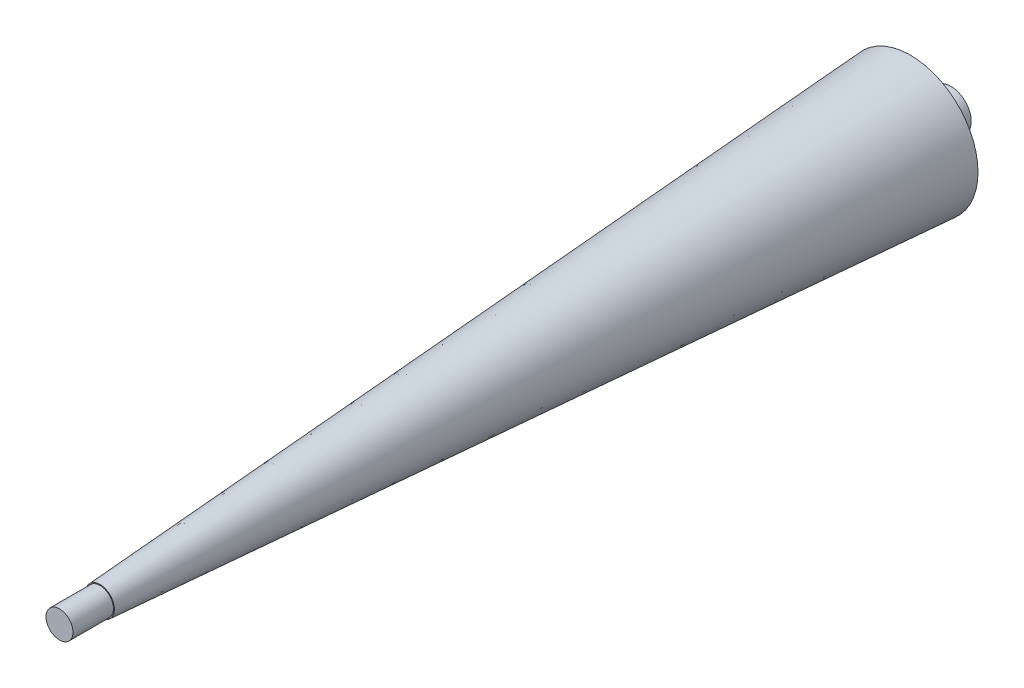
ISO-10303-21;
HEADER;
FILE_DESCRIPTION(('STEP AP214'),'2;1');
FILE_NAME('part.step','',(''),(''),'','','');
FILE_SCHEMA(('AUTOMOTIVE_DESIGN { 1 0 10303 214 1 1 1 1 }'));
ENDSEC;
DATA;
#1=APPLICATION_CONTEXT('core data for automotive mechanical design processes');
#2=APPLICATION_PROTOCOL_DEFINITION('international standard','automotive_design',2000,#1);
#3=PRODUCT_CONTEXT('',#1,'mechanical');
#4=PRODUCT('Part','Part','',(#3));
#5=PRODUCT_RELATED_PRODUCT_CATEGORY('part','',(#4));
#6=PRODUCT_DEFINITION_FORMATION('','',#4);
#7=PRODUCT_DEFINITION_CONTEXT('part definition',#1,'design');
#8=PRODUCT_DEFINITION('design','',#6,#7);
#9=PRODUCT_DEFINITION_SHAPE('','',#8);
#10=(LENGTH_UNIT() NAMED_UNIT(*) SI_UNIT(.MILLI.,.METRE.));
#11=(NAMED_UNIT(*) PLANE_ANGLE_UNIT() SI_UNIT($,.RADIAN.));
#12=(NAMED_UNIT(*) SI_UNIT($,.STERADIAN.) SOLID_ANGLE_UNIT());
#13=UNCERTAINTY_MEASURE_WITH_UNIT(LENGTH_MEASURE(1.E-05),#10,'distance_accuracy_value','');
#14=(GEOMETRIC_REPRESENTATION_CONTEXT(3) GLOBAL_UNCERTAINTY_ASSIGNED_CONTEXT((#13)) GLOBAL_UNIT_ASSIGNED_CONTEXT((#10,
#11,#12)) REPRESENTATION_CONTEXT('',''));
#15=CARTESIAN_POINT('',(0.,0.,0.));
#16=DIRECTION('',(0.,0.,1.));
#17=DIRECTION('',(1.,0.,0.));
#18=AXIS2_PLACEMENT_3D('',#15,#16,#17);
#19=CARTESIAN_POINT('',(0.,0.,0.));
#20=DIRECTION('',(0.,0.,-1.));
#21=DIRECTION('',(1.,0.,0.));
#22=AXIS2_PLACEMENT_3D('',#19,#20,#21);
#23=CONICAL_SURFACE('',#22,25.,0.0654498469497875);
#24=CARTESIAN_POINT('',(0.,0.,300.));
#25=DIRECTION('',(0.,0.,1.));
#26=DIRECTION('',(1.,0.,0.));
#27=AXIS2_PLACEMENT_3D('',#24,#25,#26);
#28=CIRCLE('',#27,5.33696115542849);
#29=CARTESIAN_POINT('',(5.33696115542849,0.,300.));
#30=VERTEX_POINT('',#29);
#31=EDGE_CURVE('E57',#30,#30,#28,.T.);
#32=CARTESIAN_POINT('',(0.,0.,0.));
#33=DIRECTION('',(0.,0.,1.));
#34=DIRECTION('',(1.,0.,0.));
#35=AXIS2_PLACEMENT_3D('',#32,#33,#34);
#36=CIRCLE('',#35,25.);
#37=CARTESIAN_POINT('',(25.,0.,0.));
#38=VERTEX_POINT('',#37);
#39=EDGE_CURVE('E53',#38,#38,#36,.T.);
#40=CARTESIAN_POINT('',(5.33696115542849,0.,300.));
#41=CARTESIAN_POINT('',(5.54178447672611,0.,296.875));
#42=CARTESIAN_POINT('',(5.74660779802373,0.,293.75));
#43=CARTESIAN_POINT('',(6.15625444061897,0.,287.5));
#44=CARTESIAN_POINT('',(6.36107776191659,0.,284.375));
#45=CARTESIAN_POINT('',(6.77072440451183,0.,278.125));
#46=CARTESIAN_POINT('',(6.97554772580945,0.,275.));
#47=CARTESIAN_POINT('',(7.38519436840469,0.,268.75));
#48=CARTESIAN_POINT('',(7.59001768970231,0.,265.625));
#49=CARTESIAN_POINT('',(7.99966433229755,0.,259.375));
#50=CARTESIAN_POINT('',(8.20448765359517,0.,256.25));
#51=CARTESIAN_POINT('',(8.61413429619041,0.,250.));
#52=CARTESIAN_POINT('',(8.81895761748803,0.,246.875));
#53=CARTESIAN_POINT('',(9.22860426008327,0.,240.625));
#54=CARTESIAN_POINT('',(9.43342758138089,0.,237.5));
#55=CARTESIAN_POINT('',(9.84307422397613,0.,231.25));
#56=CARTESIAN_POINT('',(10.0478975452737,0.,228.125));
#57=CARTESIAN_POINT('',(10.457544187869,0.,221.875));
#58=CARTESIAN_POINT('',(10.6623675091666,0.,218.75));
#59=CARTESIAN_POINT('',(11.0720141517618,0.,212.5));
#60=CARTESIAN_POINT('',(11.2768374730595,0.,209.375));
#61=CARTESIAN_POINT('',(11.6864841156547,0.,203.125));
#62=CARTESIAN_POINT('',(11.8913074369523,0.,200.));
#63=CARTESIAN_POINT('',(12.3009540795476,0.,193.75));
#64=CARTESIAN_POINT('',(12.5057774008452,0.,190.625));
#65=CARTESIAN_POINT('',(12.9154240434404,0.,184.375));
#66=CARTESIAN_POINT('',(13.120247364738,0.,181.25));
#67=CARTESIAN_POINT('',(13.5298940073333,0.,175.));
#68=CARTESIAN_POINT('',(13.7347173286309,0.,171.875));
#69=CARTESIAN_POINT('',(14.1443639712261,0.,165.625));
#70=CARTESIAN_POINT('',(14.3491872925238,0.,162.5));
#71=CARTESIAN_POINT('',(14.758833935119,0.,156.25));
#72=CARTESIAN_POINT('',(14.9636572564166,0.,153.125));
#73=CARTESIAN_POINT('',(15.3733038990119,0.,146.875));
#74=CARTESIAN_POINT('',(15.5781272203095,0.,143.75));
#75=CARTESIAN_POINT('',(15.9877738629047,0.,137.5));
#76=CARTESIAN_POINT('',(16.1925971842023,0.,134.375));
#77=CARTESIAN_POINT('',(16.6022438267976,0.,128.125));
#78=CARTESIAN_POINT('',(16.8070671480952,0.,125.));
#79=CARTESIAN_POINT('',(17.2167137906904,0.,118.75));
#80=CARTESIAN_POINT('',(17.4215371119881,0.,115.625));
#81=CARTESIAN_POINT('',(17.8311837545833,0.,109.375));
#82=CARTESIAN_POINT('',(18.0360070758809,0.,106.25));
#83=CARTESIAN_POINT('',(18.4456537184762,0.,100.));
#84=CARTESIAN_POINT('',(18.6504770397738,0.,96.875));
#85=CARTESIAN_POINT('',(19.060123682369,0.,90.625));
#86=CARTESIAN_POINT('',(19.2649470036666,0.,87.5));
#87=CARTESIAN_POINT('',(19.6745936462619,0.,81.25));
#88=CARTESIAN_POINT('',(19.8794169675595,0.,78.125));
#89=CARTESIAN_POINT('',(20.2890636101547,0.,71.875));
#90=CARTESIAN_POINT('',(20.4938869314524,0.,68.75));
#91=CARTESIAN_POINT('',(20.9035335740476,0.,62.5));
#92=CARTESIAN_POINT('',(21.1083568953452,0.,59.375));
#93=CARTESIAN_POINT('',(21.5180035379405,0.,53.125));
#94=CARTESIAN_POINT('',(21.7228268592381,0.,50.));
#95=CARTESIAN_POINT('',(22.1324735018333,0.,43.75));
#96=CARTESIAN_POINT('',(22.3372968231309,0.,40.625));
#97=CARTESIAN_POINT('',(22.7469434657262,0.,34.375));
#98=CARTESIAN_POINT('',(22.9517667870238,0.,31.25));
#99=CARTESIAN_POINT('',(23.361413429619,0.,25.));
#100=CARTESIAN_POINT('',(23.5662367509167,0.,21.875));
#101=CARTESIAN_POINT('',(23.9758833935119,0.,15.625));
#102=CARTESIAN_POINT('',(24.1807067148095,0.,12.5));
#103=CARTESIAN_POINT('',(24.5903533574048,0.,6.25000000000002));
#104=CARTESIAN_POINT('',(24.7951766787024,0.,3.12500000000001));
#105=CARTESIAN_POINT('',(25.,0.,0.));
#106=B_SPLINE_CURVE_WITH_KNOTS('',3,(#40,#41,#42,#43,#44,#45,#46,#47,#48,#49,#50,#51,#52,#53,
#54,#55,#56,#57,#58,#59,#60,#61,#62,#63,#64,#65,#66,#67,#68,#69,#70,#71,#72,#73,#74,#75,#76,#77,
#78,#79,#80,#81,#82,#83,#84,#85,#86,#87,#88,#89,#90,#91,#92,#93,#94,#95,#96,#97,#98,#99,#100,
#101,#102,#103,#104,#105),.UNSPECIFIED.,.F.,.F.,(4,2,2,2,2,2,2,2,2,2,2,2,2,2,2,2,2,2,2,2,2,2,2,
2,2,2,2,2,2,2,2,2,4),(0.,9.39511566381845,18.7902313276369,28.1853469914553,37.5804626552737,
46.9755783190922,56.3706939829106,65.765809646729,75.1609253105475,84.5560409743659,
93.9511566381843,103.346272302003,112.741387965821,122.13650362964,131.531619293458,
140.926734957276,150.321850621095,159.716966284913,169.112081948732,178.50719761255,
187.902313276369,197.297428940187,206.692544604005,216.087660267824,225.482775931642,
234.877891595461,244.273007259279,253.668122923098,263.063238586916,272.458354250734,
281.853469914553,291.248585578371,300.64370124219),.UNSPECIFIED.);
#107=EDGE_CURVE('BSEAM32',#30,#38,#106,.T.);
#108=ORIENTED_EDGE('',*,*,#31,.F.);
#109=ORIENTED_EDGE('',*,*,#39,.T.);
#110=ORIENTED_EDGE('',*,*,#107,.T.);
#111=ORIENTED_EDGE('',*,*,#107,.F.);
#112=EDGE_LOOP('',(#108,#110,#109,#111));
#113=FACE_BOUND('',#112,.T.);
#114=ADVANCED_FACE('F32',(#113),#23,.T.);
#115=CARTESIAN_POINT('',(0.,0.,300.));
#116=DIRECTION('',(0.,0.,1.));
#117=DIRECTION('',(1.,0.,0.));
#118=AXIS2_PLACEMENT_3D('',#115,#116,#117);
#119=PLANE('',#118);
#120=CARTESIAN_POINT('',(0.,0.,300.));
#121=DIRECTION('',(0.,0.,1.));
#122=DIRECTION('',(1.,0.,0.));
#123=AXIS2_PLACEMENT_3D('',#120,#121,#122);
#124=CIRCLE('',#123,5.);
#125=CARTESIAN_POINT('',(5.,0.,300.));
#126=VERTEX_POINT('',#125);
#127=EDGE_CURVE('E10',#126,#126,#124,.T.);
#128=ORIENTED_EDGE('',*,*,#127,.F.);
#129=EDGE_LOOP('',(#128));
#130=FACE_BOUND('',#129,.T.);
#131=ORIENTED_EDGE('',*,*,#31,.T.);
#132=EDGE_LOOP('',(#131));
#133=FACE_BOUND('',#132,.T.);
#134=ADVANCED_FACE('F79',(#130,#133),#119,.T.);
#135=CARTESIAN_POINT('',(0.,0.,0.));
#136=DIRECTION('',(0.,0.,1.));
#137=DIRECTION('',(1.,0.,0.));
#138=AXIS2_PLACEMENT_3D('',#135,#136,#137);
#139=PLANE('',#138);
#140=CARTESIAN_POINT('',(0.,0.,0.));
#141=DIRECTION('',(0.,0.,-1.));
#142=DIRECTION('',(-1.,0.,0.));
#143=AXIS2_PLACEMENT_3D('',#140,#141,#142);
#144=CIRCLE('',#143,7.5);
#145=CARTESIAN_POINT('',(-7.5,0.,0.));
#146=VERTEX_POINT('',#145);
#147=EDGE_CURVE('E41',#146,#146,#144,.T.);
#148=ORIENTED_EDGE('',*,*,#147,.F.);
#149=EDGE_LOOP('',(#148));
#150=FACE_BOUND('',#149,.T.);
#151=ORIENTED_EDGE('',*,*,#39,.F.);
#152=EDGE_LOOP('',(#151));
#153=FACE_BOUND('',#152,.T.);
#154=ADVANCED_FACE('F81',(#150,#153),#139,.F.);
#155=CARTESIAN_POINT('',(0.,0.,-15.));
#156=DIRECTION('',(0.,0.,1.));
#157=DIRECTION('',(1.,0.,0.));
#158=AXIS2_PLACEMENT_3D('',#155,#156,#157);
#159=CYLINDRICAL_SURFACE('',#158,7.5);
#160=CARTESIAN_POINT('',(0.,0.,-15.));
#161=DIRECTION('',(0.,0.,-1.));
#162=DIRECTION('',(-1.,0.,0.));
#163=AXIS2_PLACEMENT_3D('',#160,#161,#162);
#164=CIRCLE('',#163,7.5);
#165=CARTESIAN_POINT('',(-7.5,0.,-15.));
#166=VERTEX_POINT('',#165);
#167=EDGE_CURVE('E51',#166,#166,#164,.T.);
#168=ORIENTED_EDGE('',*,*,#167,.F.);
#169=EDGE_LOOP('',(#168));
#170=FACE_BOUND('',#169,.T.);
#171=ORIENTED_EDGE('',*,*,#147,.T.);
#172=EDGE_LOOP('',(#171));
#173=FACE_BOUND('',#172,.T.);
#174=ADVANCED_FACE('F84',(#170,#173),#159,.T.);
#175=CARTESIAN_POINT('',(0.,0.,-15.));
#176=DIRECTION('',(0.,0.,-1.));
#177=DIRECTION('',(-1.,0.,0.));
#178=AXIS2_PLACEMENT_3D('',#175,#176,#177);
#179=PLANE('',#178);
#180=ORIENTED_EDGE('',*,*,#167,.T.);
#181=EDGE_LOOP('',(#180));
#182=FACE_BOUND('',#181,.T.);
#183=ADVANCED_FACE('F91',(#182),#179,.T.);
#184=CARTESIAN_POINT('',(0.,0.,315.));
#185=DIRECTION('',(0.,0.,-1.));
#186=DIRECTION('',(-1.,0.,0.));
#187=AXIS2_PLACEMENT_3D('',#184,#185,#186);
#188=CYLINDRICAL_SURFACE('',#187,5.);
#189=CARTESIAN_POINT('',(0.,0.,315.));
#190=DIRECTION('',(0.,0.,1.));
#191=DIRECTION('',(1.,0.,0.));
#192=AXIS2_PLACEMENT_3D('',#189,#190,#191);
#193=CIRCLE('',#192,5.);
#194=CARTESIAN_POINT('',(5.,0.,315.));
#195=VERTEX_POINT('',#194);
#196=EDGE_CURVE('E50',#195,#195,#193,.T.);
#197=ORIENTED_EDGE('',*,*,#196,.F.);
#198=EDGE_LOOP('',(#197));
#199=FACE_BOUND('',#198,.T.);
#200=ORIENTED_EDGE('',*,*,#127,.T.);
#201=EDGE_LOOP('',(#200));
#202=FACE_BOUND('',#201,.T.);
#203=ADVANCED_FACE('F95',(#199,#202),#188,.T.);
#204=CARTESIAN_POINT('',(0.,0.,315.));
#205=DIRECTION('',(0.,0.,1.));
#206=DIRECTION('',(1.,0.,0.));
#207=AXIS2_PLACEMENT_3D('',#204,#205,#206);
#208=PLANE('',#207);
#209=ORIENTED_EDGE('',*,*,#196,.T.);
#210=EDGE_LOOP('',(#209));
#211=FACE_BOUND('',#210,.T.);
#212=ADVANCED_FACE('F99',(#211),#208,.T.);
#213=CLOSED_SHELL('',(#114,#134,#154,#174,#183,#203,#212));
#214=CARTESIAN_POINT('',(0.,0.,-0.327015646150716));
#215=DIRECTION('',(0.,0.,-1.));
#216=DIRECTION('',(1.,0.,0.));
#217=AXIS2_PLACEMENT_3D('',#214,#215,#216);
#218=CONICAL_SURFACE('',#217,20.010705383807,0.0654498469497875);
#219=CARTESIAN_POINT('',(0.,0.,295.));
#220=DIRECTION('',(0.,0.,1.));
#221=DIRECTION('',(1.,0.,0.));
#222=AXIS2_PLACEMENT_3D('',#219,#220,#221);
#223=CIRCLE('',#222,0.65395011546818);
#224=CARTESIAN_POINT('',(0.653950115468177,0.,295.));
#225=VERTEX_POINT('',#224);
#226=EDGE_CURVE('E46',#225,#225,#223,.T.);
#227=CARTESIAN_POINT('',(0.,0.,5.));
#228=DIRECTION('',(0.,0.,1.));
#229=DIRECTION('',(1.,0.,0.));
#230=AXIS2_PLACEMENT_3D('',#227,#228,#229);
#231=CIRCLE('',#230,19.6615543318873);
#232=CARTESIAN_POINT('',(19.6615543318873,0.,5.));
#233=VERTEX_POINT('',#232);
#234=EDGE_CURVE('E36',#233,#233,#231,.T.);
#235=CARTESIAN_POINT('',(0.653950115468177,0.,295.));
#236=CARTESIAN_POINT('',(0.851945992722542,0.,291.979166666667));
#237=CARTESIAN_POINT('',(1.04994186997691,0.,288.958333333333));
#238=CARTESIAN_POINT('',(1.44593362448564,0.,282.916666666667));
#239=CARTESIAN_POINT('',(1.64392950174001,0.,279.895833333333));
#240=CARTESIAN_POINT('',(2.03992125624874,0.,273.854166666667));
#241=CARTESIAN_POINT('',(2.2379171335031,0.,270.833333333333));
#242=CARTESIAN_POINT('',(2.63390888801184,0.,264.791666666667));
#243=CARTESIAN_POINT('',(2.8319047652662,0.,261.770833333333));
#244=CARTESIAN_POINT('',(3.22789651977494,0.,255.729166666667));
#245=CARTESIAN_POINT('',(3.4258923970293,0.,252.708333333333));
#246=CARTESIAN_POINT('',(3.82188415153803,0.,246.666666666667));
#247=CARTESIAN_POINT('',(4.0198800287924,0.,243.645833333333));
#248=CARTESIAN_POINT('',(4.41587178330113,0.,237.604166666667));
#249=CARTESIAN_POINT('',(4.6138676605555,0.,234.583333333333));
#250=CARTESIAN_POINT('',(5.00985941506423,0.,228.541666666667));
#251=CARTESIAN_POINT('',(5.2078552923186,0.,225.520833333333));
#252=CARTESIAN_POINT('',(5.60384704682733,0.,219.479166666667));
#253=CARTESIAN_POINT('',(5.80184292408169,0.,216.458333333333));
#254=CARTESIAN_POINT('',(6.19783467859042,0.,210.416666666667));
#255=CARTESIAN_POINT('',(6.39583055584479,0.,207.395833333333));
#256=CARTESIAN_POINT('',(6.79182231035352,0.,201.354166666667));
#257=CARTESIAN_POINT('',(6.98981818760789,0.,198.333333333333));
#258=CARTESIAN_POINT('',(7.38580994211662,0.,192.291666666667));
#259=CARTESIAN_POINT('',(7.58380581937099,0.,189.270833333333));
#260=CARTESIAN_POINT('',(7.97979757387972,0.,183.229166666667));
#261=CARTESIAN_POINT('',(8.17779345113408,0.,180.208333333333));
#262=CARTESIAN_POINT('',(8.57378520564281,0.,174.166666666667));
#263=CARTESIAN_POINT('',(8.77178108289718,0.,171.145833333333));
#264=CARTESIAN_POINT('',(9.16777283740591,0.,165.104166666667));
#265=CARTESIAN_POINT('',(9.36576871466028,0.,162.083333333333));
#266=CARTESIAN_POINT('',(9.76176046916901,0.,156.041666666667));
#267=CARTESIAN_POINT('',(9.95975634642338,0.,153.020833333333));
#268=CARTESIAN_POINT('',(10.3557481009321,0.,146.979166666667));
#269=CARTESIAN_POINT('',(10.5537439781865,0.,143.958333333333));
#270=CARTESIAN_POINT('',(10.9497357326952,0.,137.916666666667));
#271=CARTESIAN_POINT('',(11.1477316099496,0.,134.895833333333));
#272=CARTESIAN_POINT('',(11.5437233644583,0.,128.854166666667));
#273=CARTESIAN_POINT('',(11.7417192417127,0.,125.833333333333));
#274=CARTESIAN_POINT('',(12.1377109962214,0.,119.791666666667));
#275=CARTESIAN_POINT('',(12.3357068734758,0.,116.770833333333));
#276=CARTESIAN_POINT('',(12.7316986279845,0.,110.729166666667));
#277=CARTESIAN_POINT('',(12.9296945052389,0.,107.708333333333));
#278=CARTESIAN_POINT('',(13.3256862597476,0.,101.666666666667));
#279=CARTESIAN_POINT('',(13.523682137002,0.,98.6458333333333));
#280=CARTESIAN_POINT('',(13.9196738915107,0.,92.6041666666667));
#281=CARTESIAN_POINT('',(14.1176697687651,0.,89.5833333333333));
#282=CARTESIAN_POINT('',(14.5136615232738,0.,83.5416666666667));
#283=CARTESIAN_POINT('',(14.7116574005282,0.,80.5208333333333));
#284=CARTESIAN_POINT('',(15.1076491550369,0.,74.4791666666667));
#285=CARTESIAN_POINT('',(15.3056450322913,0.,71.4583333333334));
#286=CARTESIAN_POINT('',(15.7016367868,0.,65.4166666666667));
#287=CARTESIAN_POINT('',(15.8996326640544,0.,62.3958333333334));
#288=CARTESIAN_POINT('',(16.2956244185631,0.,56.3541666666667));
#289=CARTESIAN_POINT('',(16.4936202958175,0.,53.3333333333334));
#290=CARTESIAN_POINT('',(16.8896120503262,0.,47.2916666666667));
#291=CARTESIAN_POINT('',(17.0876079275805,0.,44.2708333333334));
#292=CARTESIAN_POINT('',(17.4835996820893,0.,38.2291666666667));
#293=CARTESIAN_POINT('',(17.6815955593436,0.,35.2083333333333));
#294=CARTESIAN_POINT('',(18.0775873138524,0.,29.1666666666667));
#295=CARTESIAN_POINT('',(18.2755831911067,0.,26.1458333333333));
#296=CARTESIAN_POINT('',(18.6715749456155,0.,20.1041666666667));
#297=CARTESIAN_POINT('',(18.8695708228698,0.,17.0833333333333));
#298=CARTESIAN_POINT('',(19.2655625773786,0.,11.0416666666667));
#299=CARTESIAN_POINT('',(19.4635584546329,0.,8.02083333333334));
#300=CARTESIAN_POINT('',(19.6615543318873,0.,5.00000000000002));
#301=B_SPLINE_CURVE_WITH_KNOTS('',3,(#235,#236,#237,#238,#239,#240,#241,#242,#243,#244,#245,
#246,#247,#248,#249,#250,#251,#252,#253,#254,#255,#256,#257,#258,#259,#260,#261,#262,#263,#264,
#265,#266,#267,#268,#269,#270,#271,#272,#273,#274,#275,#276,#277,#278,#279,#280,#281,#282,#283,
#284,#285,#286,#287,#288,#289,#290,#291,#292,#293,#294,#295,#296,#297,#298,#299,#300),
.UNSPECIFIED.,.F.,.F.,(4,2,2,2,2,2,2,2,2,2,2,2,2,2,2,2,2,2,2,2,2,2,2,2,2,2,2,2,2,2,2,2,4),(0.,
9.08194514169113,18.1638902833823,27.2458354250734,36.3277805667646,45.4097257084557,
54.4916708501469,63.573615991838,72.6555611335292,81.7375062752203,90.8194514169115,
99.9013965586026,108.983341700294,118.065286841985,127.147231983676,136.229177125367,
145.311122267058,154.39306740875,163.475012550441,172.556957692132,181.638902833823,
190.720847975514,199.802793117205,208.884738258897,217.966683400588,227.048628542279,
236.13057368397,245.212518825661,254.294463967352,263.376409109044,272.458354250735,
281.540299392426,290.622244534117),.UNSPECIFIED.);
#302=EDGE_CURVE('BSEAM66',#225,#233,#301,.T.);
#303=ORIENTED_EDGE('',*,*,#226,.T.);
#304=ORIENTED_EDGE('',*,*,#234,.F.);
#305=ORIENTED_EDGE('',*,*,#302,.T.);
#306=ORIENTED_EDGE('',*,*,#302,.F.);
#307=EDGE_LOOP('',(#303,#305,#304,#306));
#308=FACE_BOUND('',#307,.T.);
#309=ADVANCED_FACE('F66',(#308),#218,.F.);
#310=CARTESIAN_POINT('',(0.,0.,295.));
#311=DIRECTION('',(0.,0.,1.));
#312=DIRECTION('',(1.,0.,0.));
#313=AXIS2_PLACEMENT_3D('',#310,#311,#312);
#314=PLANE('',#313);
#315=ORIENTED_EDGE('',*,*,#226,.F.);
#316=EDGE_LOOP('',(#315));
#317=FACE_BOUND('',#316,.T.);
#318=ADVANCED_FACE('F68',(#317),#314,.F.);
#319=CARTESIAN_POINT('',(0.,0.,5.));
#320=DIRECTION('',(0.,0.,1.));
#321=DIRECTION('',(1.,0.,0.));
#322=AXIS2_PLACEMENT_3D('',#319,#320,#321);
#323=PLANE('',#322);
#324=ORIENTED_EDGE('',*,*,#234,.T.);
#325=EDGE_LOOP('',(#324));
#326=FACE_BOUND('',#325,.T.);
#327=ADVANCED_FACE('F34',(#326),#323,.T.);
#328=CLOSED_SHELL('',(#309,#318,#327));
#329=ORIENTED_CLOSED_SHELL('',*,#328,.T.);
#330=BREP_WITH_VOIDS('B2',#213,(#329));
#331=ADVANCED_BREP_SHAPE_REPRESENTATION('',(#18,#330),#14);
#332=SHAPE_DEFINITION_REPRESENTATION(#9,#331);
ENDSEC;
END-ISO-10303-21;
